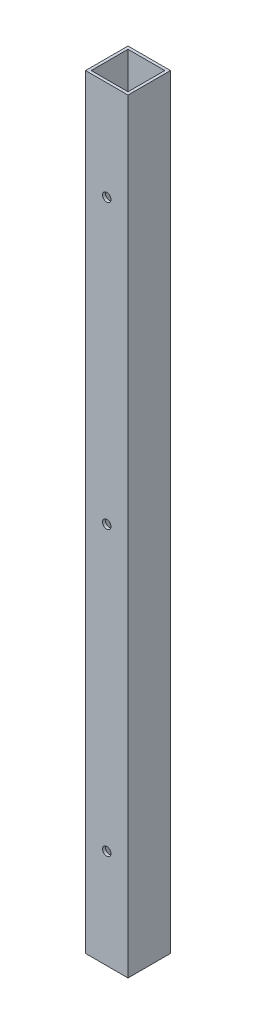
ISO-10303-21;
HEADER;
FILE_DESCRIPTION(('STEP AP214'),'2;1');
FILE_NAME('part.step','',(''),(''),'','','');
FILE_SCHEMA(('AUTOMOTIVE_DESIGN { 1 0 10303 214 1 1 1 1 }'));
ENDSEC;
DATA;
#1=APPLICATION_CONTEXT('core data for automotive mechanical design processes');
#2=APPLICATION_PROTOCOL_DEFINITION('international standard','automotive_design',2000,#1);
#3=PRODUCT_CONTEXT('',#1,'mechanical');
#4=PRODUCT('Part','Part','',(#3));
#5=PRODUCT_RELATED_PRODUCT_CATEGORY('part','',(#4));
#6=PRODUCT_DEFINITION_FORMATION('','',#4);
#7=PRODUCT_DEFINITION_CONTEXT('part definition',#1,'design');
#8=PRODUCT_DEFINITION('design','',#6,#7);
#9=PRODUCT_DEFINITION_SHAPE('','',#8);
#10=(LENGTH_UNIT() NAMED_UNIT(*) SI_UNIT(.MILLI.,.METRE.));
#11=(NAMED_UNIT(*) PLANE_ANGLE_UNIT() SI_UNIT($,.RADIAN.));
#12=(NAMED_UNIT(*) SI_UNIT($,.STERADIAN.) SOLID_ANGLE_UNIT());
#13=UNCERTAINTY_MEASURE_WITH_UNIT(LENGTH_MEASURE(1.E-05),#10,'distance_accuracy_value','');
#14=(GEOMETRIC_REPRESENTATION_CONTEXT(3) GLOBAL_UNCERTAINTY_ASSIGNED_CONTEXT((#13)) GLOBAL_UNIT_ASSIGNED_CONTEXT((#10,
#11,#12)) REPRESENTATION_CONTEXT('',''));
#15=CARTESIAN_POINT('',(0.,0.,0.));
#16=DIRECTION('',(0.,0.,1.));
#17=DIRECTION('',(1.,0.,0.));
#18=AXIS2_PLACEMENT_3D('',#15,#16,#17);
#19=CARTESIAN_POINT('',(0.,270.,0.));
#20=DIRECTION('',(0.,-1.,0.));
#21=DIRECTION('',(0.,0.,-1.));
#22=AXIS2_PLACEMENT_3D('',#19,#20,#21);
#23=PLANE('',#22);
#24=DIRECTION('',(0.,0.,-1.));
#25=VECTOR('',#24,1.);
#26=CARTESIAN_POINT('',(7.5,270.,7.5));
#27=LINE('',#26,#25);
#28=CARTESIAN_POINT('',(7.5,270.,7.5));
#29=VERTEX_POINT('',#28);
#30=CARTESIAN_POINT('',(7.5,270.,-7.5));
#31=VERTEX_POINT('',#30);
#32=EDGE_CURVE('E140',#29,#31,#27,.T.);
#33=ORIENTED_EDGE('',*,*,#32,.T.);
#34=DIRECTION('',(-1.,0.,0.));
#35=VECTOR('',#34,1.);
#36=CARTESIAN_POINT('',(-7.5,270.,-7.5));
#37=LINE('',#36,#35);
#38=CARTESIAN_POINT('',(-7.5,270.,-7.5));
#39=VERTEX_POINT('',#38);
#40=EDGE_CURVE('E143',#31,#39,#37,.T.);
#41=ORIENTED_EDGE('',*,*,#40,.T.);
#42=DIRECTION('',(0.,0.,1.));
#43=VECTOR('',#42,1.);
#44=CARTESIAN_POINT('',(-7.5,270.,7.5));
#45=LINE('',#44,#43);
#46=CARTESIAN_POINT('',(-7.5,270.,7.5));
#47=VERTEX_POINT('',#46);
#48=EDGE_CURVE('E146',#39,#47,#45,.T.);
#49=ORIENTED_EDGE('',*,*,#48,.T.);
#50=DIRECTION('',(1.,0.,0.));
#51=VECTOR('',#50,1.);
#52=CARTESIAN_POINT('',(-7.5,270.,7.5));
#53=LINE('',#52,#51);
#54=EDGE_CURVE('E148',#47,#29,#53,.T.);
#55=ORIENTED_EDGE('',*,*,#54,.T.);
#56=EDGE_LOOP('',(#33,#41,#49,#55));
#57=FACE_BOUND('',#56,.T.);
#58=DIRECTION('',(0.,0.,1.));
#59=VECTOR('',#58,1.);
#60=CARTESIAN_POINT('',(-6.5,270.,6.5));
#61=LINE('',#60,#59);
#62=CARTESIAN_POINT('',(-6.5,270.,-6.5));
#63=VERTEX_POINT('',#62);
#64=CARTESIAN_POINT('',(-6.5,270.,6.5));
#65=VERTEX_POINT('',#64);
#66=EDGE_CURVE('E102',#63,#65,#61,.T.);
#67=ORIENTED_EDGE('',*,*,#66,.F.);
#68=DIRECTION('',(-1.,0.,0.));
#69=VECTOR('',#68,1.);
#70=CARTESIAN_POINT('',(-6.5,270.,-6.5));
#71=LINE('',#70,#69);
#72=CARTESIAN_POINT('',(6.5,270.,-6.5));
#73=VERTEX_POINT('',#72);
#74=EDGE_CURVE('E124',#73,#63,#71,.T.);
#75=ORIENTED_EDGE('',*,*,#74,.F.);
#76=DIRECTION('',(0.,0.,-1.));
#77=VECTOR('',#76,1.);
#78=CARTESIAN_POINT('',(6.5,270.,6.5));
#79=LINE('',#78,#77);
#80=CARTESIAN_POINT('',(6.5,270.,6.5));
#81=VERTEX_POINT('',#80);
#82=EDGE_CURVE('E122',#81,#73,#79,.T.);
#83=ORIENTED_EDGE('',*,*,#82,.F.);
#84=DIRECTION('',(1.,0.,0.));
#85=VECTOR('',#84,1.);
#86=CARTESIAN_POINT('',(-6.5,270.,6.5));
#87=LINE('',#86,#85);
#88=EDGE_CURVE('E110',#65,#81,#87,.T.);
#89=ORIENTED_EDGE('',*,*,#88,.F.);
#90=EDGE_LOOP('',(#67,#75,#83,#89));
#91=FACE_BOUND('',#90,.T.);
#92=ADVANCED_FACE('F35',(#57,#91),#23,.F.);
#93=CARTESIAN_POINT('',(0.,0.,0.));
#94=DIRECTION('',(0.,-1.,0.));
#95=DIRECTION('',(0.,0.,-1.));
#96=AXIS2_PLACEMENT_3D('',#93,#94,#95);
#97=PLANE('',#96);
#98=DIRECTION('',(0.,0.,-1.));
#99=VECTOR('',#98,1.);
#100=CARTESIAN_POINT('',(7.5,0.,7.5));
#101=LINE('',#100,#99);
#102=CARTESIAN_POINT('',(7.5,0.,7.5));
#103=VERTEX_POINT('',#102);
#104=CARTESIAN_POINT('',(7.5,0.,-7.5));
#105=VERTEX_POINT('',#104);
#106=EDGE_CURVE('E118',#103,#105,#101,.T.);
#107=ORIENTED_EDGE('',*,*,#106,.F.);
#108=DIRECTION('',(1.,0.,0.));
#109=VECTOR('',#108,1.);
#110=CARTESIAN_POINT('',(-7.5,0.,7.5));
#111=LINE('',#110,#109);
#112=CARTESIAN_POINT('',(-7.5,0.,7.5));
#113=VERTEX_POINT('',#112);
#114=EDGE_CURVE('E144',#113,#103,#111,.T.);
#115=ORIENTED_EDGE('',*,*,#114,.F.);
#116=DIRECTION('',(0.,0.,1.));
#117=VECTOR('',#116,1.);
#118=CARTESIAN_POINT('',(-7.5,0.,7.5));
#119=LINE('',#118,#117);
#120=CARTESIAN_POINT('',(-7.5,0.,-7.5));
#121=VERTEX_POINT('',#120);
#122=EDGE_CURVE('E155',#121,#113,#119,.T.);
#123=ORIENTED_EDGE('',*,*,#122,.F.);
#124=DIRECTION('',(-1.,0.,0.));
#125=VECTOR('',#124,1.);
#126=CARTESIAN_POINT('',(-7.5,0.,-7.5));
#127=LINE('',#126,#125);
#128=EDGE_CURVE('E153',#105,#121,#127,.T.);
#129=ORIENTED_EDGE('',*,*,#128,.F.);
#130=EDGE_LOOP('',(#107,#115,#123,#129));
#131=FACE_BOUND('',#130,.T.);
#132=DIRECTION('',(-1.,0.,0.));
#133=VECTOR('',#132,1.);
#134=CARTESIAN_POINT('',(-6.5,0.,-6.5));
#135=LINE('',#134,#133);
#136=CARTESIAN_POINT('',(6.5,0.,-6.5));
#137=VERTEX_POINT('',#136);
#138=CARTESIAN_POINT('',(-6.5,0.,-6.5));
#139=VERTEX_POINT('',#138);
#140=EDGE_CURVE('E111',#137,#139,#135,.T.);
#141=ORIENTED_EDGE('',*,*,#140,.T.);
#142=DIRECTION('',(0.,0.,1.));
#143=VECTOR('',#142,1.);
#144=CARTESIAN_POINT('',(-6.5,0.,6.5));
#145=LINE('',#144,#143);
#146=CARTESIAN_POINT('',(-6.5,0.,6.5));
#147=VERTEX_POINT('',#146);
#148=EDGE_CURVE('E60',#139,#147,#145,.T.);
#149=ORIENTED_EDGE('',*,*,#148,.T.);
#150=DIRECTION('',(1.,0.,0.));
#151=VECTOR('',#150,1.);
#152=CARTESIAN_POINT('',(-6.5,0.,6.5));
#153=LINE('',#152,#151);
#154=CARTESIAN_POINT('',(6.5,0.,6.5));
#155=VERTEX_POINT('',#154);
#156=EDGE_CURVE('E117',#147,#155,#153,.T.);
#157=ORIENTED_EDGE('',*,*,#156,.T.);
#158=DIRECTION('',(0.,0.,-1.));
#159=VECTOR('',#158,1.);
#160=CARTESIAN_POINT('',(6.5,0.,6.5));
#161=LINE('',#160,#159);
#162=EDGE_CURVE('E132',#155,#137,#161,.T.);
#163=ORIENTED_EDGE('',*,*,#162,.T.);
#164=EDGE_LOOP('',(#141,#149,#157,#163));
#165=FACE_BOUND('',#164,.T.);
#166=ADVANCED_FACE('F219',(#131,#165),#97,.T.);
#167=CARTESIAN_POINT('',(7.5,270.,7.5));
#168=DIRECTION('',(-1.,0.,0.));
#169=DIRECTION('',(0.,0.,1.));
#170=AXIS2_PLACEMENT_3D('',#167,#168,#169);
#171=PLANE('',#170);
#172=ORIENTED_EDGE('',*,*,#106,.T.);
#173=DIRECTION('',(0.,-1.,0.));
#174=VECTOR('',#173,1.);
#175=CARTESIAN_POINT('',(7.5,270.,-7.5));
#176=LINE('',#175,#174);
#177=EDGE_CURVE('E11',#31,#105,#176,.T.);
#178=ORIENTED_EDGE('',*,*,#177,.F.);
#179=ORIENTED_EDGE('',*,*,#32,.F.);
#180=DIRECTION('',(0.,-1.,0.));
#181=VECTOR('',#180,1.);
#182=CARTESIAN_POINT('',(7.5,270.,7.5));
#183=LINE('',#182,#181);
#184=EDGE_CURVE('E150',#29,#103,#183,.T.);
#185=ORIENTED_EDGE('',*,*,#184,.T.);
#186=EDGE_LOOP('',(#172,#178,#179,#185));
#187=FACE_BOUND('',#186,.T.);
#188=ADVANCED_FACE('F37',(#187),#171,.F.);
#189=CARTESIAN_POINT('',(-7.5,270.,-7.5));
#190=DIRECTION('',(0.,0.,1.));
#191=DIRECTION('',(1.,0.,0.));
#192=AXIS2_PLACEMENT_3D('',#189,#190,#191);
#193=PLANE('',#192);
#194=CARTESIAN_POINT('',(0.,35.,-7.5));
#195=DIRECTION('',(0.,0.,1.));
#196=DIRECTION('',(-1.,0.,0.));
#197=AXIS2_PLACEMENT_3D('',#194,#195,#196);
#198=CIRCLE('',#197,1.5);
#199=CARTESIAN_POINT('',(-1.5,35.,-7.5));
#200=VERTEX_POINT('',#199);
#201=EDGE_CURVE('E171',#200,#200,#198,.T.);
#202=ORIENTED_EDGE('',*,*,#201,.T.);
#203=EDGE_LOOP('',(#202));
#204=FACE_BOUND('',#203,.T.);
#205=CARTESIAN_POINT('',(0.,135.,-7.5));
#206=DIRECTION('',(0.,0.,1.));
#207=DIRECTION('',(1.,0.,0.));
#208=AXIS2_PLACEMENT_3D('',#205,#206,#207);
#209=CIRCLE('',#208,1.5);
#210=CARTESIAN_POINT('',(1.5,135.,-7.5));
#211=VERTEX_POINT('',#210);
#212=EDGE_CURVE('E182',#211,#211,#209,.T.);
#213=ORIENTED_EDGE('',*,*,#212,.T.);
#214=EDGE_LOOP('',(#213));
#215=FACE_BOUND('',#214,.T.);
#216=CARTESIAN_POINT('',(0.,235.,-7.5));
#217=DIRECTION('',(0.,0.,1.));
#218=DIRECTION('',(1.,0.,0.));
#219=AXIS2_PLACEMENT_3D('',#216,#217,#218);
#220=CIRCLE('',#219,1.5);
#221=CARTESIAN_POINT('',(1.50000000000001,235.,-7.5));
#222=VERTEX_POINT('',#221);
#223=EDGE_CURVE('E167',#222,#222,#220,.T.);
#224=ORIENTED_EDGE('',*,*,#223,.T.);
#225=EDGE_LOOP('',(#224));
#226=FACE_BOUND('',#225,.T.);
#227=ORIENTED_EDGE('',*,*,#128,.T.);
#228=DIRECTION('',(0.,-1.,0.));
#229=VECTOR('',#228,1.);
#230=CARTESIAN_POINT('',(-7.5,270.,-7.5));
#231=LINE('',#230,#229);
#232=EDGE_CURVE('E44',#39,#121,#231,.T.);
#233=ORIENTED_EDGE('',*,*,#232,.F.);
#234=ORIENTED_EDGE('',*,*,#40,.F.);
#235=ORIENTED_EDGE('',*,*,#177,.T.);
#236=EDGE_LOOP('',(#227,#233,#234,#235));
#237=FACE_BOUND('',#236,.T.);
#238=ADVANCED_FACE('F233',(#204,#215,#226,#237),#193,.F.);
#239=CARTESIAN_POINT('',(-7.5,270.,7.5));
#240=DIRECTION('',(1.,0.,0.));
#241=DIRECTION('',(0.,0.,-1.));
#242=AXIS2_PLACEMENT_3D('',#239,#240,#241);
#243=PLANE('',#242);
#244=ORIENTED_EDGE('',*,*,#122,.T.);
#245=DIRECTION('',(0.,-1.,0.));
#246=VECTOR('',#245,1.);
#247=CARTESIAN_POINT('',(-7.5,270.,7.5));
#248=LINE('',#247,#246);
#249=EDGE_CURVE('E160',#47,#113,#248,.T.);
#250=ORIENTED_EDGE('',*,*,#249,.F.);
#251=ORIENTED_EDGE('',*,*,#48,.F.);
#252=ORIENTED_EDGE('',*,*,#232,.T.);
#253=EDGE_LOOP('',(#244,#250,#251,#252));
#254=FACE_BOUND('',#253,.T.);
#255=ADVANCED_FACE('F230',(#254),#243,.F.);
#256=CARTESIAN_POINT('',(-7.5,270.,7.5));
#257=DIRECTION('',(0.,0.,-1.));
#258=DIRECTION('',(-1.,0.,0.));
#259=AXIS2_PLACEMENT_3D('',#256,#257,#258);
#260=PLANE('',#259);
#261=CARTESIAN_POINT('',(0.,35.,7.5));
#262=DIRECTION('',(0.,0.,1.));
#263=DIRECTION('',(-1.,0.,0.));
#264=AXIS2_PLACEMENT_3D('',#261,#262,#263);
#265=CIRCLE('',#264,1.5);
#266=CARTESIAN_POINT('',(-1.5,35.,7.5));
#267=VERTEX_POINT('',#266);
#268=EDGE_CURVE('E177',#267,#267,#265,.T.);
#269=ORIENTED_EDGE('',*,*,#268,.F.);
#270=EDGE_LOOP('',(#269));
#271=FACE_BOUND('',#270,.T.);
#272=CARTESIAN_POINT('',(0.,135.,7.5));
#273=DIRECTION('',(0.,0.,1.));
#274=DIRECTION('',(1.,0.,0.));
#275=AXIS2_PLACEMENT_3D('',#272,#273,#274);
#276=CIRCLE('',#275,1.5);
#277=CARTESIAN_POINT('',(1.5,135.,7.5));
#278=VERTEX_POINT('',#277);
#279=EDGE_CURVE('E187',#278,#278,#276,.T.);
#280=ORIENTED_EDGE('',*,*,#279,.F.);
#281=EDGE_LOOP('',(#280));
#282=FACE_BOUND('',#281,.T.);
#283=CARTESIAN_POINT('',(0.,235.,7.5));
#284=DIRECTION('',(0.,0.,1.));
#285=DIRECTION('',(1.,0.,0.));
#286=AXIS2_PLACEMENT_3D('',#283,#284,#285);
#287=CIRCLE('',#286,1.5);
#288=CARTESIAN_POINT('',(1.50000000000001,235.,7.5));
#289=VERTEX_POINT('',#288);
#290=EDGE_CURVE('E193',#289,#289,#287,.T.);
#291=ORIENTED_EDGE('',*,*,#290,.F.);
#292=EDGE_LOOP('',(#291));
#293=FACE_BOUND('',#292,.T.);
#294=ORIENTED_EDGE('',*,*,#114,.T.);
#295=ORIENTED_EDGE('',*,*,#184,.F.);
#296=ORIENTED_EDGE('',*,*,#54,.F.);
#297=ORIENTED_EDGE('',*,*,#249,.T.);
#298=EDGE_LOOP('',(#294,#295,#296,#297));
#299=FACE_BOUND('',#298,.T.);
#300=ADVANCED_FACE('F214',(#271,#282,#293,#299),#260,.F.);
#301=CARTESIAN_POINT('',(-6.5,270.,6.5));
#302=DIRECTION('',(1.,0.,0.));
#303=DIRECTION('',(0.,0.,-1.));
#304=AXIS2_PLACEMENT_3D('',#301,#302,#303);
#305=PLANE('',#304);
#306=ORIENTED_EDGE('',*,*,#148,.F.);
#307=DIRECTION('',(0.,-1.,0.));
#308=VECTOR('',#307,1.);
#309=CARTESIAN_POINT('',(-6.5,270.,-6.5));
#310=LINE('',#309,#308);
#311=EDGE_CURVE('E106',#63,#139,#310,.T.);
#312=ORIENTED_EDGE('',*,*,#311,.F.);
#313=ORIENTED_EDGE('',*,*,#66,.T.);
#314=DIRECTION('',(0.,-1.,0.));
#315=VECTOR('',#314,1.);
#316=CARTESIAN_POINT('',(-6.5,270.,6.5));
#317=LINE('',#316,#315);
#318=EDGE_CURVE('E105',#65,#147,#317,.T.);
#319=ORIENTED_EDGE('',*,*,#318,.T.);
#320=EDGE_LOOP('',(#306,#312,#313,#319));
#321=FACE_BOUND('',#320,.T.);
#322=ADVANCED_FACE('F104',(#321),#305,.T.);
#323=CARTESIAN_POINT('',(-6.5,270.,6.5));
#324=DIRECTION('',(0.,0.,-1.));
#325=DIRECTION('',(-1.,0.,0.));
#326=AXIS2_PLACEMENT_3D('',#323,#324,#325);
#327=PLANE('',#326);
#328=CARTESIAN_POINT('',(0.,35.,6.5));
#329=DIRECTION('',(0.,0.,-1.));
#330=DIRECTION('',(-1.,0.,0.));
#331=AXIS2_PLACEMENT_3D('',#328,#329,#330);
#332=CIRCLE('',#331,1.5);
#333=CARTESIAN_POINT('',(-1.5,35.,6.5));
#334=VERTEX_POINT('',#333);
#335=EDGE_CURVE('E190',#334,#334,#332,.T.);
#336=ORIENTED_EDGE('',*,*,#335,.F.);
#337=EDGE_LOOP('',(#336));
#338=FACE_BOUND('',#337,.T.);
#339=CARTESIAN_POINT('',(0.,135.,6.5));
#340=DIRECTION('',(0.,0.,-1.));
#341=DIRECTION('',(-1.,0.,0.));
#342=AXIS2_PLACEMENT_3D('',#339,#340,#341);
#343=CIRCLE('',#342,1.5);
#344=CARTESIAN_POINT('',(-1.5,135.,6.5));
#345=VERTEX_POINT('',#344);
#346=EDGE_CURVE('E170',#345,#345,#343,.T.);
#347=ORIENTED_EDGE('',*,*,#346,.F.);
#348=EDGE_LOOP('',(#347));
#349=FACE_BOUND('',#348,.T.);
#350=CARTESIAN_POINT('',(0.,235.,6.5));
#351=DIRECTION('',(0.,0.,-1.));
#352=DIRECTION('',(-1.,0.,0.));
#353=AXIS2_PLACEMENT_3D('',#350,#351,#352);
#354=CIRCLE('',#353,1.5);
#355=CARTESIAN_POINT('',(-1.5,235.,6.5));
#356=VERTEX_POINT('',#355);
#357=EDGE_CURVE('E130',#356,#356,#354,.T.);
#358=ORIENTED_EDGE('',*,*,#357,.F.);
#359=EDGE_LOOP('',(#358));
#360=FACE_BOUND('',#359,.T.);
#361=ORIENTED_EDGE('',*,*,#156,.F.);
#362=ORIENTED_EDGE('',*,*,#318,.F.);
#363=ORIENTED_EDGE('',*,*,#88,.T.);
#364=DIRECTION('',(0.,-1.,0.));
#365=VECTOR('',#364,1.);
#366=CARTESIAN_POINT('',(6.5,270.,6.5));
#367=LINE('',#366,#365);
#368=EDGE_CURVE('E119',#81,#155,#367,.T.);
#369=ORIENTED_EDGE('',*,*,#368,.T.);
#370=EDGE_LOOP('',(#361,#362,#363,#369));
#371=FACE_BOUND('',#370,.T.);
#372=ADVANCED_FACE('F114',(#338,#349,#360,#371),#327,.T.);
#373=CARTESIAN_POINT('',(6.5,270.,6.5));
#374=DIRECTION('',(-1.,0.,0.));
#375=DIRECTION('',(0.,0.,1.));
#376=AXIS2_PLACEMENT_3D('',#373,#374,#375);
#377=PLANE('',#376);
#378=ORIENTED_EDGE('',*,*,#162,.F.);
#379=ORIENTED_EDGE('',*,*,#368,.F.);
#380=ORIENTED_EDGE('',*,*,#82,.T.);
#381=DIRECTION('',(0.,-1.,0.));
#382=VECTOR('',#381,1.);
#383=CARTESIAN_POINT('',(6.5,270.,-6.5));
#384=LINE('',#383,#382);
#385=EDGE_CURVE('E52',#73,#137,#384,.T.);
#386=ORIENTED_EDGE('',*,*,#385,.T.);
#387=EDGE_LOOP('',(#378,#379,#380,#386));
#388=FACE_BOUND('',#387,.T.);
#389=ADVANCED_FACE('F204',(#388),#377,.T.);
#390=CARTESIAN_POINT('',(-6.5,270.,-6.5));
#391=DIRECTION('',(0.,0.,1.));
#392=DIRECTION('',(1.,0.,0.));
#393=AXIS2_PLACEMENT_3D('',#390,#391,#392);
#394=PLANE('',#393);
#395=CARTESIAN_POINT('',(0.,35.,-6.5));
#396=DIRECTION('',(0.,0.,1.));
#397=DIRECTION('',(1.,0.,0.));
#398=AXIS2_PLACEMENT_3D('',#395,#396,#397);
#399=CIRCLE('',#398,1.5);
#400=CARTESIAN_POINT('',(1.50000000000001,35.,-6.5));
#401=VERTEX_POINT('',#400);
#402=EDGE_CURVE('E39',#401,#401,#399,.T.);
#403=ORIENTED_EDGE('',*,*,#402,.F.);
#404=EDGE_LOOP('',(#403));
#405=FACE_BOUND('',#404,.T.);
#406=CARTESIAN_POINT('',(0.,135.,-6.5));
#407=DIRECTION('',(0.,0.,1.));
#408=DIRECTION('',(1.,0.,0.));
#409=AXIS2_PLACEMENT_3D('',#406,#407,#408);
#410=CIRCLE('',#409,1.5);
#411=CARTESIAN_POINT('',(1.5,135.,-6.5));
#412=VERTEX_POINT('',#411);
#413=EDGE_CURVE('E168',#412,#412,#410,.T.);
#414=ORIENTED_EDGE('',*,*,#413,.F.);
#415=EDGE_LOOP('',(#414));
#416=FACE_BOUND('',#415,.T.);
#417=CARTESIAN_POINT('',(0.,235.,-6.5));
#418=DIRECTION('',(0.,0.,1.));
#419=DIRECTION('',(1.,0.,0.));
#420=AXIS2_PLACEMENT_3D('',#417,#418,#419);
#421=CIRCLE('',#420,1.5);
#422=CARTESIAN_POINT('',(1.50000000000001,235.,-6.5));
#423=VERTEX_POINT('',#422);
#424=EDGE_CURVE('E165',#423,#423,#421,.T.);
#425=ORIENTED_EDGE('',*,*,#424,.F.);
#426=EDGE_LOOP('',(#425));
#427=FACE_BOUND('',#426,.T.);
#428=ORIENTED_EDGE('',*,*,#140,.F.);
#429=ORIENTED_EDGE('',*,*,#385,.F.);
#430=ORIENTED_EDGE('',*,*,#74,.T.);
#431=ORIENTED_EDGE('',*,*,#311,.T.);
#432=EDGE_LOOP('',(#428,#429,#430,#431));
#433=FACE_BOUND('',#432,.T.);
#434=ADVANCED_FACE('F211',(#405,#416,#427,#433),#394,.T.);
#435=CARTESIAN_POINT('',(0.,235.,-7.5));
#436=DIRECTION('',(0.,0.,1.));
#437=DIRECTION('',(1.,0.,0.));
#438=AXIS2_PLACEMENT_3D('',#435,#436,#437);
#439=CYLINDRICAL_SURFACE('',#438,1.5);
#440=ORIENTED_EDGE('',*,*,#424,.T.);
#441=EDGE_LOOP('',(#440));
#442=FACE_BOUND('',#441,.T.);
#443=ORIENTED_EDGE('',*,*,#223,.F.);
#444=EDGE_LOOP('',(#443));
#445=FACE_BOUND('',#444,.T.);
#446=ADVANCED_FACE('F259',(#442,#445),#439,.F.);
#447=ORIENTED_EDGE('',*,*,#357,.T.);
#448=EDGE_LOOP('',(#447));
#449=FACE_BOUND('',#448,.T.);
#450=ORIENTED_EDGE('',*,*,#290,.T.);
#451=EDGE_LOOP('',(#450));
#452=FACE_BOUND('',#451,.T.);
#453=ADVANCED_FACE('F200',(#449,#452),#439,.F.);
#454=CARTESIAN_POINT('',(0.,135.,-7.5));
#455=DIRECTION('',(0.,0.,1.));
#456=DIRECTION('',(1.,0.,0.));
#457=AXIS2_PLACEMENT_3D('',#454,#455,#456);
#458=CYLINDRICAL_SURFACE('',#457,1.5);
#459=ORIENTED_EDGE('',*,*,#413,.T.);
#460=EDGE_LOOP('',(#459));
#461=FACE_BOUND('',#460,.T.);
#462=ORIENTED_EDGE('',*,*,#212,.F.);
#463=EDGE_LOOP('',(#462));
#464=FACE_BOUND('',#463,.T.);
#465=ADVANCED_FACE('F270',(#461,#464),#458,.F.);
#466=CARTESIAN_POINT('',(0.,35.,-7.5));
#467=DIRECTION('',(0.,0.,1.));
#468=DIRECTION('',(1.,0.,0.));
#469=AXIS2_PLACEMENT_3D('',#466,#467,#468);
#470=CYLINDRICAL_SURFACE('',#469,1.5);
#471=ORIENTED_EDGE('',*,*,#402,.T.);
#472=EDGE_LOOP('',(#471));
#473=FACE_BOUND('',#472,.T.);
#474=ORIENTED_EDGE('',*,*,#201,.F.);
#475=EDGE_LOOP('',(#474));
#476=FACE_BOUND('',#475,.T.);
#477=ADVANCED_FACE('F273',(#473,#476),#470,.F.);
#478=ORIENTED_EDGE('',*,*,#346,.T.);
#479=EDGE_LOOP('',(#478));
#480=FACE_BOUND('',#479,.T.);
#481=ORIENTED_EDGE('',*,*,#279,.T.);
#482=EDGE_LOOP('',(#481));
#483=FACE_BOUND('',#482,.T.);
#484=ADVANCED_FACE('F274',(#480,#483),#458,.F.);
#485=ORIENTED_EDGE('',*,*,#335,.T.);
#486=EDGE_LOOP('',(#485));
#487=FACE_BOUND('',#486,.T.);
#488=ORIENTED_EDGE('',*,*,#268,.T.);
#489=EDGE_LOOP('',(#488));
#490=FACE_BOUND('',#489,.T.);
#491=ADVANCED_FACE('F277',(#487,#490),#470,.F.);
#492=CLOSED_SHELL('',(#92,#166,#188,#238,#255,#300,#322,#372,#389,#434,#446,#453,#465,#477,#484,#491));
#493=MANIFOLD_SOLID_BREP('B2',#492);
#494=ADVANCED_BREP_SHAPE_REPRESENTATION('',(#18,#493),#14);
#495=SHAPE_DEFINITION_REPRESENTATION(#9,#494);
ENDSEC;
END-ISO-10303-21;
